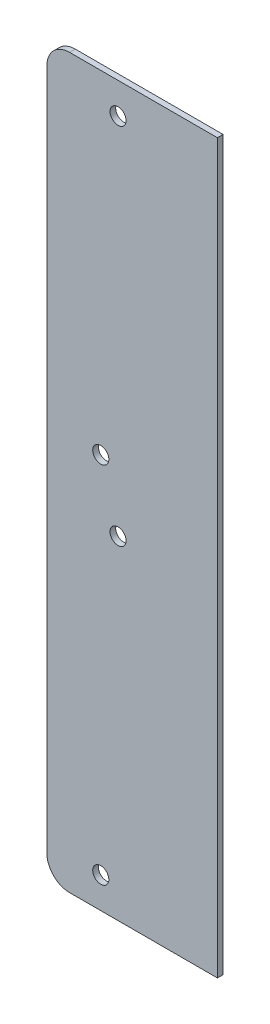
ISO-10303-21;
HEADER;
FILE_DESCRIPTION(('STEP AP214'),'2;1');
FILE_NAME('part.step','',(''),(''),'','','');
FILE_SCHEMA(('AUTOMOTIVE_DESIGN { 1 0 10303 214 1 1 1 1 }'));
ENDSEC;
DATA;
#1=APPLICATION_CONTEXT('core data for automotive mechanical design processes');
#2=APPLICATION_PROTOCOL_DEFINITION('international standard','automotive_design',2000,#1);
#3=PRODUCT_CONTEXT('',#1,'mechanical');
#4=PRODUCT('Part','Part','',(#3));
#5=PRODUCT_RELATED_PRODUCT_CATEGORY('part','',(#4));
#6=PRODUCT_DEFINITION_FORMATION('','',#4);
#7=PRODUCT_DEFINITION_CONTEXT('part definition',#1,'design');
#8=PRODUCT_DEFINITION('design','',#6,#7);
#9=PRODUCT_DEFINITION_SHAPE('','',#8);
#10=(LENGTH_UNIT() NAMED_UNIT(*) SI_UNIT(.MILLI.,.METRE.));
#11=(NAMED_UNIT(*) PLANE_ANGLE_UNIT() SI_UNIT($,.RADIAN.));
#12=(NAMED_UNIT(*) SI_UNIT($,.STERADIAN.) SOLID_ANGLE_UNIT());
#13=UNCERTAINTY_MEASURE_WITH_UNIT(LENGTH_MEASURE(1.E-05),#10,'distance_accuracy_value','');
#14=(GEOMETRIC_REPRESENTATION_CONTEXT(3) GLOBAL_UNCERTAINTY_ASSIGNED_CONTEXT((#13)) GLOBAL_UNIT_ASSIGNED_CONTEXT((#10,
#11,#12)) REPRESENTATION_CONTEXT('',''));
#15=CARTESIAN_POINT('',(0.,0.,0.));
#16=DIRECTION('',(0.,0.,1.));
#17=DIRECTION('',(1.,0.,0.));
#18=AXIS2_PLACEMENT_3D('',#15,#16,#17);
#19=CARTESIAN_POINT('',(-17.4625,50.8,1.5875));
#20=DIRECTION('',(1.,0.,0.));
#21=DIRECTION('',(0.,1.,0.));
#22=AXIS2_PLACEMENT_3D('',#19,#20,#21);
#23=PLANE('',#22);
#24=DIRECTION('',(0.,-1.,0.));
#25=VECTOR('',#24,1.);
#26=CARTESIAN_POINT('',(-17.4625,50.8,0.));
#27=LINE('',#26,#25);
#28=CARTESIAN_POINT('',(-17.4625,146.05,0.));
#29=VERTEX_POINT('',#28);
#30=CARTESIAN_POINT('',(-17.4625,-44.45,0.));
#31=VERTEX_POINT('',#30);
#32=EDGE_CURVE('E103',#29,#31,#27,.T.);
#33=ORIENTED_EDGE('',*,*,#32,.T.);
#34=DIRECTION('',(0.,0.,-1.));
#35=VECTOR('',#34,1.);
#36=CARTESIAN_POINT('',(-17.4625,-44.45,1.5875));
#37=LINE('',#36,#35);
#38=CARTESIAN_POINT('',(-17.4625,-44.45,1.5875));
#39=VERTEX_POINT('',#38);
#40=EDGE_CURVE('E58',#31,#39,#37,.F.);
#41=ORIENTED_EDGE('',*,*,#40,.T.);
#42=DIRECTION('',(0.,-1.,0.));
#43=VECTOR('',#42,1.);
#44=CARTESIAN_POINT('',(-17.4625,50.8,1.5875));
#45=LINE('',#44,#43);
#46=CARTESIAN_POINT('',(-17.4625,146.05,1.5875));
#47=VERTEX_POINT('',#46);
#48=EDGE_CURVE('E102',#47,#39,#45,.T.);
#49=ORIENTED_EDGE('',*,*,#48,.F.);
#50=DIRECTION('',(0.,0.,1.));
#51=VECTOR('',#50,1.);
#52=CARTESIAN_POINT('',(-17.4625,146.05,1.5875));
#53=LINE('',#52,#51);
#54=EDGE_CURVE('E159',#47,#29,#53,.F.);
#55=ORIENTED_EDGE('',*,*,#54,.T.);
#56=EDGE_LOOP('',(#33,#41,#49,#55));
#57=FACE_BOUND('',#56,.T.);
#58=ADVANCED_FACE('F36',(#57),#23,.F.);
#59=CARTESIAN_POINT('',(-17.4625,-50.8,1.5875));
#60=DIRECTION('',(0.,1.,0.));
#61=DIRECTION('',(0.,0.,1.));
#62=AXIS2_PLACEMENT_3D('',#59,#60,#61);
#63=PLANE('',#62);
#64=DIRECTION('',(1.,0.,0.));
#65=VECTOR('',#64,1.);
#66=CARTESIAN_POINT('',(-17.4625,-50.8,1.5875));
#67=LINE('',#66,#65);
#68=CARTESIAN_POINT('',(-11.1125,-50.8,1.5875));
#69=VERTEX_POINT('',#68);
#70=CARTESIAN_POINT('',(30.1625,-50.8,1.5875));
#71=VERTEX_POINT('',#70);
#72=EDGE_CURVE('E151',#69,#71,#67,.T.);
#73=ORIENTED_EDGE('',*,*,#72,.F.);
#74=DIRECTION('',(0.,0.,-1.));
#75=VECTOR('',#74,1.);
#76=CARTESIAN_POINT('',(-11.1125,-50.8,1.5875));
#77=LINE('',#76,#75);
#78=CARTESIAN_POINT('',(-11.1125,-50.8,0.));
#79=VERTEX_POINT('',#78);
#80=EDGE_CURVE('E99',#69,#79,#77,.T.);
#81=ORIENTED_EDGE('',*,*,#80,.T.);
#82=DIRECTION('',(1.,0.,0.));
#83=VECTOR('',#82,1.);
#84=CARTESIAN_POINT('',(-17.4625,-50.8,0.));
#85=LINE('',#84,#83);
#86=CARTESIAN_POINT('',(30.1625,-50.8,0.));
#87=VERTEX_POINT('',#86);
#88=EDGE_CURVE('E92',#79,#87,#85,.T.);
#89=ORIENTED_EDGE('',*,*,#88,.T.);
#90=DIRECTION('',(0.,0.,1.));
#91=VECTOR('',#90,1.);
#92=CARTESIAN_POINT('',(30.1625,-50.8,0.));
#93=LINE('',#92,#91);
#94=EDGE_CURVE('E96',#87,#71,#93,.T.);
#95=ORIENTED_EDGE('',*,*,#94,.T.);
#96=EDGE_LOOP('',(#73,#81,#89,#95));
#97=FACE_BOUND('',#96,.T.);
#98=ADVANCED_FACE('F95',(#97),#63,.F.);
#99=CARTESIAN_POINT('',(0.,0.,1.5875));
#100=DIRECTION('',(0.,0.,1.));
#101=DIRECTION('',(1.,0.,0.));
#102=AXIS2_PLACEMENT_3D('',#99,#100,#101);
#103=PLANE('',#102);
#104=CARTESIAN_POINT('',(-2.413,-42.164,1.5875));
#105=DIRECTION('',(0.,0.,1.));
#106=DIRECTION('',(1.,0.,0.));
#107=AXIS2_PLACEMENT_3D('',#104,#105,#106);
#108=CIRCLE('',#107,2.24999999999999);
#109=CARTESIAN_POINT('',(-0.163000000000011,-42.164,1.5875));
#110=VERTEX_POINT('',#109);
#111=EDGE_CURVE('E132',#110,#110,#108,.T.);
#112=ORIENTED_EDGE('',*,*,#111,.F.);
#113=EDGE_LOOP('',(#112));
#114=FACE_BOUND('',#113,.T.);
#115=CARTESIAN_POINT('',(2.413,42.164,1.5875));
#116=DIRECTION('',(0.,0.,1.));
#117=DIRECTION('',(1.,0.,0.));
#118=AXIS2_PLACEMENT_3D('',#115,#116,#117);
#119=CIRCLE('',#118,2.24999999999999);
#120=CARTESIAN_POINT('',(4.66299999999999,42.164,1.5875));
#121=VERTEX_POINT('',#120);
#122=EDGE_CURVE('E144',#121,#121,#119,.T.);
#123=ORIENTED_EDGE('',*,*,#122,.F.);
#124=EDGE_LOOP('',(#123));
#125=FACE_BOUND('',#124,.T.);
#126=ORIENTED_EDGE('',*,*,#48,.T.);
#127=CARTESIAN_POINT('',(-11.1125,-44.45,1.5875));
#128=DIRECTION('',(0.,0.,1.));
#129=DIRECTION('',(1.,0.,0.));
#130=AXIS2_PLACEMENT_3D('',#127,#128,#129);
#131=CIRCLE('',#130,6.35);
#132=EDGE_CURVE('E44',#39,#69,#131,.T.);
#133=ORIENTED_EDGE('',*,*,#132,.T.);
#134=ORIENTED_EDGE('',*,*,#72,.T.);
#135=DIRECTION('',(0.,1.,0.));
#136=VECTOR('',#135,1.);
#137=CARTESIAN_POINT('',(30.1625,152.4,1.5875));
#138=LINE('',#137,#136);
#139=CARTESIAN_POINT('',(30.1625,152.4,1.5875));
#140=VERTEX_POINT('',#139);
#141=EDGE_CURVE('E111',#71,#140,#138,.T.);
#142=ORIENTED_EDGE('',*,*,#141,.T.);
#143=DIRECTION('',(1.,0.,0.));
#144=VECTOR('',#143,1.);
#145=CARTESIAN_POINT('',(0.,152.4,1.5875));
#146=LINE('',#145,#144);
#147=CARTESIAN_POINT('',(-11.1125,152.4,1.5875));
#148=VERTEX_POINT('',#147);
#149=EDGE_CURVE('E128',#148,#140,#146,.T.);
#150=ORIENTED_EDGE('',*,*,#149,.F.);
#151=CARTESIAN_POINT('',(-11.1125,146.05,1.5875));
#152=DIRECTION('',(0.,0.,1.));
#153=DIRECTION('',(1.,0.,0.));
#154=AXIS2_PLACEMENT_3D('',#151,#152,#153);
#155=CIRCLE('',#154,6.35);
#156=EDGE_CURVE('E51',#148,#47,#155,.T.);
#157=ORIENTED_EDGE('',*,*,#156,.T.);
#158=EDGE_LOOP('',(#126,#133,#134,#142,#150,#157));
#159=FACE_BOUND('',#158,.T.);
#160=CARTESIAN_POINT('',(-2.413,59.4359999999999,1.5875));
#161=DIRECTION('',(0.,0.,1.));
#162=DIRECTION('',(1.,0.,0.));
#163=AXIS2_PLACEMENT_3D('',#160,#161,#162);
#164=CIRCLE('',#163,2.24999999999999);
#165=CARTESIAN_POINT('',(-0.163000000000012,59.4359999999999,1.5875));
#166=VERTEX_POINT('',#165);
#167=EDGE_CURVE('E122',#166,#166,#164,.T.);
#168=ORIENTED_EDGE('',*,*,#167,.F.);
#169=EDGE_LOOP('',(#168));
#170=FACE_BOUND('',#169,.T.);
#171=CARTESIAN_POINT('',(2.413,143.764,1.5875));
#172=DIRECTION('',(0.,0.,1.));
#173=DIRECTION('',(1.,0.,0.));
#174=AXIS2_PLACEMENT_3D('',#171,#172,#173);
#175=CIRCLE('',#174,2.24999999999998);
#176=CARTESIAN_POINT('',(4.66299999999998,143.764,1.5875));
#177=VERTEX_POINT('',#176);
#178=EDGE_CURVE('E135',#177,#177,#175,.T.);
#179=ORIENTED_EDGE('',*,*,#178,.F.);
#180=EDGE_LOOP('',(#179));
#181=FACE_BOUND('',#180,.T.);
#182=ADVANCED_FACE('F164',(#114,#125,#159,#170,#181),#103,.T.);
#183=CARTESIAN_POINT('',(0.,0.,0.));
#184=DIRECTION('',(0.,0.,1.));
#185=DIRECTION('',(1.,0.,0.));
#186=AXIS2_PLACEMENT_3D('',#183,#184,#185);
#187=PLANE('',#186);
#188=CARTESIAN_POINT('',(-2.413,-42.164,0.));
#189=DIRECTION('',(0.,0.,1.));
#190=DIRECTION('',(1.,0.,0.));
#191=AXIS2_PLACEMENT_3D('',#188,#189,#190);
#192=CIRCLE('',#191,2.25);
#193=CARTESIAN_POINT('',(-0.163,-42.164,0.));
#194=VERTEX_POINT('',#193);
#195=EDGE_CURVE('E141',#194,#194,#192,.T.);
#196=ORIENTED_EDGE('',*,*,#195,.T.);
#197=EDGE_LOOP('',(#196));
#198=FACE_BOUND('',#197,.T.);
#199=CARTESIAN_POINT('',(2.413,42.164,0.));
#200=DIRECTION('',(0.,0.,1.));
#201=DIRECTION('',(1.,0.,0.));
#202=AXIS2_PLACEMENT_3D('',#199,#200,#201);
#203=CIRCLE('',#202,2.25);
#204=CARTESIAN_POINT('',(4.663,42.164,0.));
#205=VERTEX_POINT('',#204);
#206=EDGE_CURVE('E147',#205,#205,#203,.T.);
#207=ORIENTED_EDGE('',*,*,#206,.T.);
#208=EDGE_LOOP('',(#207));
#209=FACE_BOUND('',#208,.T.);
#210=ORIENTED_EDGE('',*,*,#88,.F.);
#211=CARTESIAN_POINT('',(-11.1125,-44.45,0.));
#212=DIRECTION('',(0.,0.,1.));
#213=DIRECTION('',(1.,0.,0.));
#214=AXIS2_PLACEMENT_3D('',#211,#212,#213);
#215=CIRCLE('',#214,6.35);
#216=EDGE_CURVE('E157',#79,#31,#215,.F.);
#217=ORIENTED_EDGE('',*,*,#216,.T.);
#218=ORIENTED_EDGE('',*,*,#32,.F.);
#219=CARTESIAN_POINT('',(-11.1125,146.05,0.));
#220=DIRECTION('',(0.,0.,1.));
#221=DIRECTION('',(1.,0.,0.));
#222=AXIS2_PLACEMENT_3D('',#219,#220,#221);
#223=CIRCLE('',#222,6.35);
#224=CARTESIAN_POINT('',(-11.1125,152.4,0.));
#225=VERTEX_POINT('',#224);
#226=EDGE_CURVE('E155',#29,#225,#223,.F.);
#227=ORIENTED_EDGE('',*,*,#226,.T.);
#228=DIRECTION('',(1.,0.,0.));
#229=VECTOR('',#228,1.);
#230=CARTESIAN_POINT('',(0.,152.4,0.));
#231=LINE('',#230,#229);
#232=CARTESIAN_POINT('',(30.1625,152.4,0.));
#233=VERTEX_POINT('',#232);
#234=EDGE_CURVE('E117',#225,#233,#231,.T.);
#235=ORIENTED_EDGE('',*,*,#234,.T.);
#236=DIRECTION('',(0.,1.,0.));
#237=VECTOR('',#236,1.);
#238=CARTESIAN_POINT('',(30.1625,152.4,0.));
#239=LINE('',#238,#237);
#240=EDGE_CURVE('E109',#87,#233,#239,.T.);
#241=ORIENTED_EDGE('',*,*,#240,.F.);
#242=EDGE_LOOP('',(#210,#217,#218,#227,#235,#241));
#243=FACE_BOUND('',#242,.T.);
#244=CARTESIAN_POINT('',(-2.413,59.4359999999999,0.));
#245=DIRECTION('',(0.,0.,1.));
#246=DIRECTION('',(1.,0.,0.));
#247=AXIS2_PLACEMENT_3D('',#244,#245,#246);
#248=CIRCLE('',#247,2.24999999999999);
#249=CARTESIAN_POINT('',(-0.163000000000012,59.4359999999999,0.));
#250=VERTEX_POINT('',#249);
#251=EDGE_CURVE('E124',#250,#250,#248,.T.);
#252=ORIENTED_EDGE('',*,*,#251,.T.);
#253=EDGE_LOOP('',(#252));
#254=FACE_BOUND('',#253,.T.);
#255=CARTESIAN_POINT('',(2.413,143.764,0.));
#256=DIRECTION('',(0.,0.,1.));
#257=DIRECTION('',(1.,0.,0.));
#258=AXIS2_PLACEMENT_3D('',#255,#256,#257);
#259=CIRCLE('',#258,2.24999999999998);
#260=CARTESIAN_POINT('',(4.66299999999998,143.764,0.));
#261=VERTEX_POINT('',#260);
#262=EDGE_CURVE('E127',#261,#261,#259,.T.);
#263=ORIENTED_EDGE('',*,*,#262,.T.);
#264=EDGE_LOOP('',(#263));
#265=FACE_BOUND('',#264,.T.);
#266=ADVANCED_FACE('F114',(#198,#209,#243,#254,#265),#187,.F.);
#267=CARTESIAN_POINT('',(2.413,42.164,1.5875));
#268=DIRECTION('',(0.,0.,1.));
#269=DIRECTION('',(1.,0.,0.));
#270=AXIS2_PLACEMENT_3D('',#267,#268,#269);
#271=CYLINDRICAL_SURFACE('',#270,2.24999999999999);
#272=ORIENTED_EDGE('',*,*,#206,.F.);
#273=EDGE_LOOP('',(#272));
#274=FACE_BOUND('',#273,.T.);
#275=ORIENTED_EDGE('',*,*,#122,.T.);
#276=EDGE_LOOP('',(#275));
#277=FACE_BOUND('',#276,.T.);
#278=ADVANCED_FACE('F184',(#274,#277),#271,.F.);
#279=CARTESIAN_POINT('',(-2.413,-42.164,1.5875));
#280=DIRECTION('',(0.,0.,1.));
#281=DIRECTION('',(1.,0.,0.));
#282=AXIS2_PLACEMENT_3D('',#279,#280,#281);
#283=CYLINDRICAL_SURFACE('',#282,2.24999999999999);
#284=ORIENTED_EDGE('',*,*,#195,.F.);
#285=EDGE_LOOP('',(#284));
#286=FACE_BOUND('',#285,.T.);
#287=ORIENTED_EDGE('',*,*,#111,.T.);
#288=EDGE_LOOP('',(#287));
#289=FACE_BOUND('',#288,.T.);
#290=ADVANCED_FACE('F175',(#286,#289),#283,.F.);
#291=CARTESIAN_POINT('',(0.,152.4,0.));
#292=DIRECTION('',(0.,-1.,0.));
#293=DIRECTION('',(0.,0.,-1.));
#294=AXIS2_PLACEMENT_3D('',#291,#292,#293);
#295=PLANE('',#294);
#296=ORIENTED_EDGE('',*,*,#234,.F.);
#297=DIRECTION('',(0.,0.,1.));
#298=VECTOR('',#297,1.);
#299=CARTESIAN_POINT('',(-11.1125,152.4,0.));
#300=LINE('',#299,#298);
#301=EDGE_CURVE('E11',#225,#148,#300,.T.);
#302=ORIENTED_EDGE('',*,*,#301,.T.);
#303=ORIENTED_EDGE('',*,*,#149,.T.);
#304=DIRECTION('',(0.,0.,1.));
#305=VECTOR('',#304,1.);
#306=CARTESIAN_POINT('',(30.1625,152.4,0.));
#307=LINE('',#306,#305);
#308=EDGE_CURVE('E112',#233,#140,#307,.T.);
#309=ORIENTED_EDGE('',*,*,#308,.F.);
#310=EDGE_LOOP('',(#296,#302,#303,#309));
#311=FACE_BOUND('',#310,.T.);
#312=ADVANCED_FACE('F171',(#311),#295,.F.);
#313=CARTESIAN_POINT('',(2.413,143.764,0.));
#314=DIRECTION('',(0.,0.,1.));
#315=DIRECTION('',(1.,0.,0.));
#316=AXIS2_PLACEMENT_3D('',#313,#314,#315);
#317=CYLINDRICAL_SURFACE('',#316,2.24999999999998);
#318=ORIENTED_EDGE('',*,*,#262,.F.);
#319=EDGE_LOOP('',(#318));
#320=FACE_BOUND('',#319,.T.);
#321=ORIENTED_EDGE('',*,*,#178,.T.);
#322=EDGE_LOOP('',(#321));
#323=FACE_BOUND('',#322,.T.);
#324=ADVANCED_FACE('F174',(#320,#323),#317,.F.);
#325=CARTESIAN_POINT('',(-2.413,59.4359999999999,0.));
#326=DIRECTION('',(0.,0.,1.));
#327=DIRECTION('',(1.,0.,0.));
#328=AXIS2_PLACEMENT_3D('',#325,#326,#327);
#329=CYLINDRICAL_SURFACE('',#328,2.24999999999999);
#330=ORIENTED_EDGE('',*,*,#251,.F.);
#331=EDGE_LOOP('',(#330));
#332=FACE_BOUND('',#331,.T.);
#333=ORIENTED_EDGE('',*,*,#167,.T.);
#334=EDGE_LOOP('',(#333));
#335=FACE_BOUND('',#334,.T.);
#336=ADVANCED_FACE('F181',(#332,#335),#329,.F.);
#337=CARTESIAN_POINT('',(30.1625,152.4,0.));
#338=DIRECTION('',(1.,0.,0.));
#339=DIRECTION('',(0.,1.,0.));
#340=AXIS2_PLACEMENT_3D('',#337,#338,#339);
#341=PLANE('',#340);
#342=ORIENTED_EDGE('',*,*,#141,.F.);
#343=ORIENTED_EDGE('',*,*,#94,.F.);
#344=ORIENTED_EDGE('',*,*,#240,.T.);
#345=ORIENTED_EDGE('',*,*,#308,.T.);
#346=EDGE_LOOP('',(#342,#343,#344,#345));
#347=FACE_BOUND('',#346,.T.);
#348=ADVANCED_FACE('F107',(#347),#341,.T.);
#349=CARTESIAN_POINT('',(-11.1125,-44.45,1.5875));
#350=DIRECTION('',(0.,0.,-1.));
#351=DIRECTION('',(-1.,0.,0.));
#352=AXIS2_PLACEMENT_3D('',#349,#350,#351);
#353=CYLINDRICAL_SURFACE('',#352,6.35);
#354=ORIENTED_EDGE('',*,*,#132,.F.);
#355=ORIENTED_EDGE('',*,*,#40,.F.);
#356=ORIENTED_EDGE('',*,*,#216,.F.);
#357=ORIENTED_EDGE('',*,*,#80,.F.);
#358=EDGE_LOOP('',(#354,#355,#356,#357));
#359=FACE_BOUND('',#358,.T.);
#360=ADVANCED_FACE('F167',(#359),#353,.T.);
#361=CARTESIAN_POINT('',(-11.1125,146.05,0.));
#362=DIRECTION('',(0.,0.,1.));
#363=DIRECTION('',(1.,0.,0.));
#364=AXIS2_PLACEMENT_3D('',#361,#362,#363);
#365=CYLINDRICAL_SURFACE('',#364,6.35);
#366=ORIENTED_EDGE('',*,*,#226,.F.);
#367=ORIENTED_EDGE('',*,*,#54,.F.);
#368=ORIENTED_EDGE('',*,*,#156,.F.);
#369=ORIENTED_EDGE('',*,*,#301,.F.);
#370=EDGE_LOOP('',(#366,#367,#368,#369));
#371=FACE_BOUND('',#370,.T.);
#372=ADVANCED_FACE('F38',(#371),#365,.T.);
#373=CLOSED_SHELL('',(#58,#98,#182,#266,#278,#290,#312,#324,#336,#348,#360,#372));
#374=MANIFOLD_SOLID_BREP('B2',#373);
#375=ADVANCED_BREP_SHAPE_REPRESENTATION('',(#18,#374),#14);
#376=SHAPE_DEFINITION_REPRESENTATION(#9,#375);
ENDSEC;
END-ISO-10303-21;
